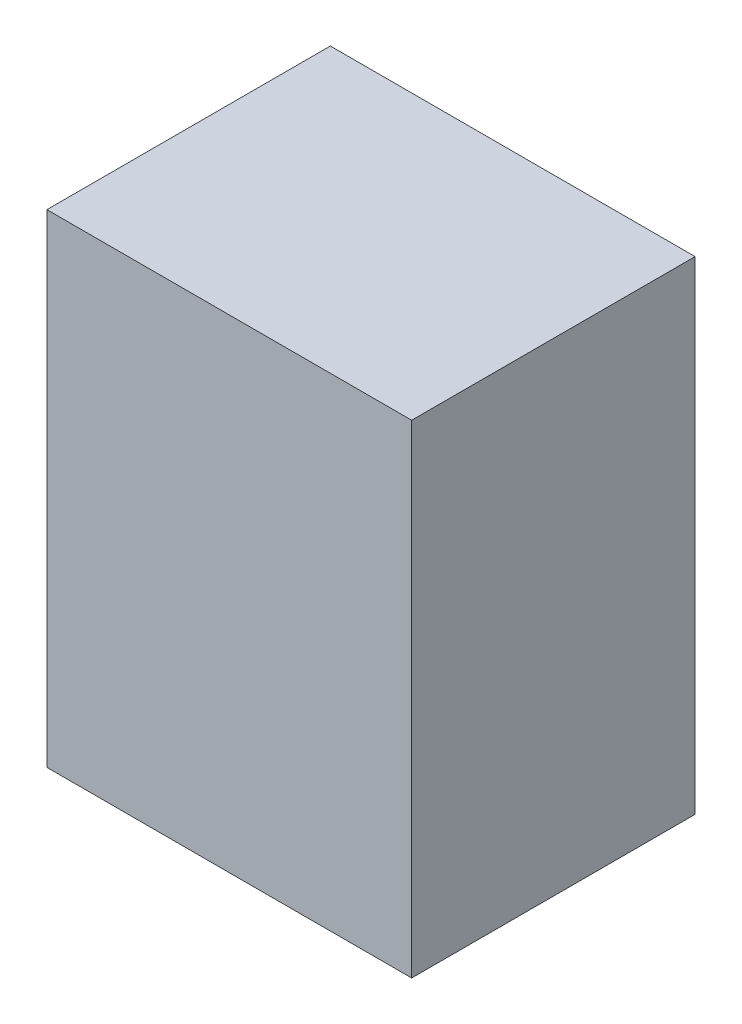
ISO-10303-21;
HEADER;
FILE_DESCRIPTION(('STEP AP214'),'2;1');
FILE_NAME('part.step','',(''),(''),'','','');
FILE_SCHEMA(('AUTOMOTIVE_DESIGN { 1 0 10303 214 1 1 1 1 }'));
ENDSEC;
DATA;
#1=APPLICATION_CONTEXT('core data for automotive mechanical design processes');
#2=APPLICATION_PROTOCOL_DEFINITION('international standard','automotive_design',2000,#1);
#3=PRODUCT_CONTEXT('',#1,'mechanical');
#4=PRODUCT('Part','Part','',(#3));
#5=PRODUCT_RELATED_PRODUCT_CATEGORY('part','',(#4));
#6=PRODUCT_DEFINITION_FORMATION('','',#4);
#7=PRODUCT_DEFINITION_CONTEXT('part definition',#1,'design');
#8=PRODUCT_DEFINITION('design','',#6,#7);
#9=PRODUCT_DEFINITION_SHAPE('','',#8);
#10=(LENGTH_UNIT() NAMED_UNIT(*) SI_UNIT(.MILLI.,.METRE.));
#11=(NAMED_UNIT(*) PLANE_ANGLE_UNIT() SI_UNIT($,.RADIAN.));
#12=(NAMED_UNIT(*) SI_UNIT($,.STERADIAN.) SOLID_ANGLE_UNIT());
#13=UNCERTAINTY_MEASURE_WITH_UNIT(LENGTH_MEASURE(1.E-05),#10,'distance_accuracy_value','');
#14=(GEOMETRIC_REPRESENTATION_CONTEXT(3) GLOBAL_UNCERTAINTY_ASSIGNED_CONTEXT((#13)) GLOBAL_UNIT_ASSIGNED_CONTEXT((#10,
#11,#12)) REPRESENTATION_CONTEXT('',''));
#15=CARTESIAN_POINT('',(0.,0.,0.));
#16=DIRECTION('',(0.,0.,1.));
#17=DIRECTION('',(1.,0.,0.));
#18=AXIS2_PLACEMENT_3D('',#15,#16,#17);
#19=CARTESIAN_POINT('',(16.3,-174.,236.875));
#20=DIRECTION('',(0.,0.,1.));
#21=DIRECTION('',(1.,0.,0.));
#22=AXIS2_PLACEMENT_3D('',#19,#20,#21);
#23=PLANE('',#22);
#24=DIRECTION('',(1.,0.,0.));
#25=VECTOR('',#24,1.);
#26=CARTESIAN_POINT('',(16.3,-174.,236.875));
#27=LINE('',#26,#25);
#28=CARTESIAN_POINT('',(16.3,-174.,236.875));
#29=VERTEX_POINT('',#28);
#30=CARTESIAN_POINT('',(23.7,-174.,236.875));
#31=VERTEX_POINT('',#30);
#32=EDGE_CURVE('E75',#29,#31,#27,.T.);
#33=ORIENTED_EDGE('',*,*,#32,.F.);
#34=DIRECTION('',(0.,-1.,0.));
#35=VECTOR('',#34,1.);
#36=CARTESIAN_POINT('',(16.3,-174.,236.875));
#37=LINE('',#36,#35);
#38=CARTESIAN_POINT('',(16.3,-183.8,236.875));
#39=VERTEX_POINT('',#38);
#40=EDGE_CURVE('E19',#29,#39,#37,.T.);
#41=ORIENTED_EDGE('',*,*,#40,.T.);
#42=DIRECTION('',(1.,0.,0.));
#43=VECTOR('',#42,1.);
#44=CARTESIAN_POINT('',(16.3,-183.8,236.875));
#45=LINE('',#44,#43);
#46=CARTESIAN_POINT('',(23.7,-183.8,236.875));
#47=VERTEX_POINT('',#46);
#48=EDGE_CURVE('E71',#39,#47,#45,.T.);
#49=ORIENTED_EDGE('',*,*,#48,.T.);
#50=DIRECTION('',(0.,-1.,0.));
#51=VECTOR('',#50,1.);
#52=CARTESIAN_POINT('',(23.7,-174.,236.875));
#53=LINE('',#52,#51);
#54=EDGE_CURVE('E10',#31,#47,#53,.T.);
#55=ORIENTED_EDGE('',*,*,#54,.F.);
#56=EDGE_LOOP('',(#33,#41,#49,#55));
#57=FACE_BOUND('',#56,.T.);
#58=ADVANCED_FACE('F15',(#57),#23,.T.);
#59=CARTESIAN_POINT('',(16.3,-174.,231.125));
#60=DIRECTION('',(0.,0.,1.));
#61=DIRECTION('',(1.,0.,0.));
#62=AXIS2_PLACEMENT_3D('',#59,#60,#61);
#63=PLANE('',#62);
#64=DIRECTION('',(0.,-1.,0.));
#65=VECTOR('',#64,1.);
#66=CARTESIAN_POINT('',(23.7,-174.,231.125));
#67=LINE('',#66,#65);
#68=CARTESIAN_POINT('',(23.7,-174.,231.125));
#69=VERTEX_POINT('',#68);
#70=CARTESIAN_POINT('',(23.7,-183.8,231.125));
#71=VERTEX_POINT('',#70);
#72=EDGE_CURVE('E26',#69,#71,#67,.T.);
#73=ORIENTED_EDGE('',*,*,#72,.T.);
#74=DIRECTION('',(1.,0.,0.));
#75=VECTOR('',#74,1.);
#76=CARTESIAN_POINT('',(16.3,-183.8,231.125));
#77=LINE('',#76,#75);
#78=CARTESIAN_POINT('',(16.3,-183.8,231.125));
#79=VERTEX_POINT('',#78);
#80=EDGE_CURVE('E90',#79,#71,#77,.T.);
#81=ORIENTED_EDGE('',*,*,#80,.F.);
#82=DIRECTION('',(0.,-1.,0.));
#83=VECTOR('',#82,1.);
#84=CARTESIAN_POINT('',(16.3,-174.,231.125));
#85=LINE('',#84,#83);
#86=CARTESIAN_POINT('',(16.3,-174.,231.125));
#87=VERTEX_POINT('',#86);
#88=EDGE_CURVE('E70',#87,#79,#85,.T.);
#89=ORIENTED_EDGE('',*,*,#88,.F.);
#90=DIRECTION('',(1.,0.,0.));
#91=VECTOR('',#90,1.);
#92=CARTESIAN_POINT('',(16.3,-174.,231.125));
#93=LINE('',#92,#91);
#94=EDGE_CURVE('E77',#87,#69,#93,.T.);
#95=ORIENTED_EDGE('',*,*,#94,.T.);
#96=EDGE_LOOP('',(#73,#81,#89,#95));
#97=FACE_BOUND('',#96,.T.);
#98=ADVANCED_FACE('F107',(#97),#63,.F.);
#99=CARTESIAN_POINT('',(23.7,-174.,231.125));
#100=DIRECTION('',(1.,0.,0.));
#101=DIRECTION('',(0.,1.,0.));
#102=AXIS2_PLACEMENT_3D('',#99,#100,#101);
#103=PLANE('',#102);
#104=ORIENTED_EDGE('',*,*,#72,.F.);
#105=DIRECTION('',(0.,0.,1.));
#106=VECTOR('',#105,1.);
#107=CARTESIAN_POINT('',(23.7,-174.,231.125));
#108=LINE('',#107,#106);
#109=EDGE_CURVE('E81',#69,#31,#108,.T.);
#110=ORIENTED_EDGE('',*,*,#109,.T.);
#111=ORIENTED_EDGE('',*,*,#54,.T.);
#112=DIRECTION('',(0.,0.,1.));
#113=VECTOR('',#112,1.);
#114=CARTESIAN_POINT('',(23.7,-183.8,231.125));
#115=LINE('',#114,#113);
#116=EDGE_CURVE('E92',#71,#47,#115,.T.);
#117=ORIENTED_EDGE('',*,*,#116,.F.);
#118=EDGE_LOOP('',(#104,#110,#111,#117));
#119=FACE_BOUND('',#118,.T.);
#120=ADVANCED_FACE('F104',(#119),#103,.T.);
#121=CARTESIAN_POINT('',(16.3,-174.,231.125));
#122=DIRECTION('',(1.,0.,0.));
#123=DIRECTION('',(0.,1.,0.));
#124=AXIS2_PLACEMENT_3D('',#121,#122,#123);
#125=PLANE('',#124);
#126=DIRECTION('',(0.,0.,1.));
#127=VECTOR('',#126,1.);
#128=CARTESIAN_POINT('',(16.3,-183.8,231.125));
#129=LINE('',#128,#127);
#130=EDGE_CURVE('E67',#79,#39,#129,.T.);
#131=ORIENTED_EDGE('',*,*,#130,.T.);
#132=ORIENTED_EDGE('',*,*,#40,.F.);
#133=DIRECTION('',(0.,0.,1.));
#134=VECTOR('',#133,1.);
#135=CARTESIAN_POINT('',(16.3,-174.,231.125));
#136=LINE('',#135,#134);
#137=EDGE_CURVE('E64',#87,#29,#136,.T.);
#138=ORIENTED_EDGE('',*,*,#137,.F.);
#139=ORIENTED_EDGE('',*,*,#88,.T.);
#140=EDGE_LOOP('',(#131,#132,#138,#139));
#141=FACE_BOUND('',#140,.T.);
#142=ADVANCED_FACE('F62',(#141),#125,.F.);
#143=CARTESIAN_POINT('',(16.3,-183.8,231.125));
#144=DIRECTION('',(0.,-1.,0.));
#145=DIRECTION('',(0.,0.,-1.));
#146=AXIS2_PLACEMENT_3D('',#143,#144,#145);
#147=PLANE('',#146);
#148=ORIENTED_EDGE('',*,*,#130,.F.);
#149=ORIENTED_EDGE('',*,*,#80,.T.);
#150=ORIENTED_EDGE('',*,*,#116,.T.);
#151=ORIENTED_EDGE('',*,*,#48,.F.);
#152=EDGE_LOOP('',(#148,#149,#150,#151));
#153=FACE_BOUND('',#152,.T.);
#154=ADVANCED_FACE('F102',(#153),#147,.T.);
#155=CARTESIAN_POINT('',(16.3,-174.,231.125));
#156=DIRECTION('',(0.,-1.,0.));
#157=DIRECTION('',(0.,0.,-1.));
#158=AXIS2_PLACEMENT_3D('',#155,#156,#157);
#159=PLANE('',#158);
#160=ORIENTED_EDGE('',*,*,#32,.T.);
#161=ORIENTED_EDGE('',*,*,#109,.F.);
#162=ORIENTED_EDGE('',*,*,#94,.F.);
#163=ORIENTED_EDGE('',*,*,#137,.T.);
#164=EDGE_LOOP('',(#160,#161,#162,#163));
#165=FACE_BOUND('',#164,.T.);
#166=ADVANCED_FACE('F17',(#165),#159,.F.);
#167=CLOSED_SHELL('',(#58,#98,#120,#142,#154,#166));
#168=MANIFOLD_SOLID_BREP('B1',#167);
#169=ADVANCED_BREP_SHAPE_REPRESENTATION('',(#18,#168),#14);
#170=SHAPE_DEFINITION_REPRESENTATION(#9,#169);
ENDSEC;
END-ISO-10303-21;
